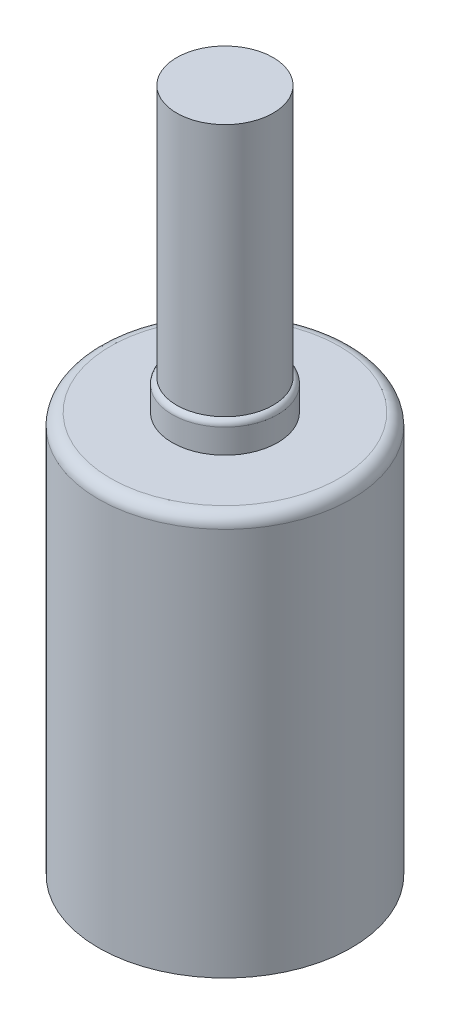
ISO-10303-21;
HEADER;
FILE_DESCRIPTION(('STEP AP214'),'2;1');
FILE_NAME('part.step','',(''),(''),'','','');
FILE_SCHEMA(('AUTOMOTIVE_DESIGN { 1 0 10303 214 1 1 1 1 }'));
ENDSEC;
DATA;
#1=APPLICATION_CONTEXT('core data for automotive mechanical design processes');
#2=APPLICATION_PROTOCOL_DEFINITION('international standard','automotive_design',2000,#1);
#3=PRODUCT_CONTEXT('',#1,'mechanical');
#4=PRODUCT('Part','Part','',(#3));
#5=PRODUCT_RELATED_PRODUCT_CATEGORY('part','',(#4));
#6=PRODUCT_DEFINITION_FORMATION('','',#4);
#7=PRODUCT_DEFINITION_CONTEXT('part definition',#1,'design');
#8=PRODUCT_DEFINITION('design','',#6,#7);
#9=PRODUCT_DEFINITION_SHAPE('','',#8);
#10=(LENGTH_UNIT() NAMED_UNIT(*) SI_UNIT(.MILLI.,.METRE.));
#11=(NAMED_UNIT(*) PLANE_ANGLE_UNIT() SI_UNIT($,.RADIAN.));
#12=(NAMED_UNIT(*) SI_UNIT($,.STERADIAN.) SOLID_ANGLE_UNIT());
#13=UNCERTAINTY_MEASURE_WITH_UNIT(LENGTH_MEASURE(1.E-05),#10,'distance_accuracy_value','');
#14=(GEOMETRIC_REPRESENTATION_CONTEXT(3) GLOBAL_UNCERTAINTY_ASSIGNED_CONTEXT((#13)) GLOBAL_UNIT_ASSIGNED_CONTEXT((#10,
#11,#12)) REPRESENTATION_CONTEXT('',''));
#15=CARTESIAN_POINT('',(0.,0.,0.));
#16=DIRECTION('',(0.,0.,1.));
#17=DIRECTION('',(1.,0.,0.));
#18=AXIS2_PLACEMENT_3D('',#15,#16,#17);
#19=CARTESIAN_POINT('',(0.,66.5,0.));
#20=DIRECTION('',(0.,-1.,0.));
#21=DIRECTION('',(0.,0.,-1.));
#22=AXIS2_PLACEMENT_3D('',#19,#20,#21);
#23=CYLINDRICAL_SURFACE('',#22,21.);
#24=CARTESIAN_POINT('',(0.,64.5,0.));
#25=DIRECTION('',(0.,1.,0.));
#26=DIRECTION('',(0.,0.,1.));
#27=AXIS2_PLACEMENT_3D('',#24,#25,#26);
#28=CIRCLE('',#27,21.);
#29=CARTESIAN_POINT('',(0.,64.5,21.));
#30=VERTEX_POINT('',#29);
#31=EDGE_CURVE('E56',#30,#30,#28,.F.);
#32=ORIENTED_EDGE('',*,*,#31,.T.);
#33=EDGE_LOOP('',(#32));
#34=FACE_BOUND('',#33,.T.);
#35=CARTESIAN_POINT('',(0.,0.,0.));
#36=DIRECTION('',(0.,1.,0.));
#37=DIRECTION('',(0.,0.,1.));
#38=AXIS2_PLACEMENT_3D('',#35,#36,#37);
#39=CIRCLE('',#38,21.);
#40=CARTESIAN_POINT('',(0.,0.,21.));
#41=VERTEX_POINT('',#40);
#42=EDGE_CURVE('E64',#41,#41,#39,.T.);
#43=ORIENTED_EDGE('',*,*,#42,.T.);
#44=EDGE_LOOP('',(#43));
#45=FACE_BOUND('',#44,.T.);
#46=ADVANCED_FACE('F32',(#34,#45),#23,.T.);
#47=CARTESIAN_POINT('',(0.,66.5,0.));
#48=DIRECTION('',(0.,1.,0.));
#49=DIRECTION('',(0.,0.,1.));
#50=AXIS2_PLACEMENT_3D('',#47,#48,#49);
#51=PLANE('',#50);
#52=CARTESIAN_POINT('',(0.,66.5,0.));
#53=DIRECTION('',(0.,1.,0.));
#54=DIRECTION('',(0.,0.,1.));
#55=AXIS2_PLACEMENT_3D('',#52,#53,#54);
#56=CIRCLE('',#55,19.);
#57=CARTESIAN_POINT('',(0.,66.5,19.));
#58=VERTEX_POINT('',#57);
#59=EDGE_CURVE('E60',#58,#58,#56,.T.);
#60=ORIENTED_EDGE('',*,*,#59,.T.);
#61=EDGE_LOOP('',(#60));
#62=FACE_BOUND('',#61,.T.);
#63=CARTESIAN_POINT('',(0.,66.5,0.));
#64=DIRECTION('',(0.,1.,0.));
#65=DIRECTION('',(0.,0.,1.));
#66=AXIS2_PLACEMENT_3D('',#63,#64,#65);
#67=CIRCLE('',#66,8.75);
#68=CARTESIAN_POINT('',(0.,66.5,8.75));
#69=VERTEX_POINT('',#68);
#70=EDGE_CURVE('E63',#69,#69,#67,.T.);
#71=ORIENTED_EDGE('',*,*,#70,.F.);
#72=EDGE_LOOP('',(#71));
#73=FACE_BOUND('',#72,.T.);
#74=ADVANCED_FACE('F103',(#62,#73),#51,.T.);
#75=CARTESIAN_POINT('',(0.,0.,0.));
#76=DIRECTION('',(0.,1.,0.));
#77=DIRECTION('',(0.,0.,1.));
#78=AXIS2_PLACEMENT_3D('',#75,#76,#77);
#79=PLANE('',#78);
#80=CARTESIAN_POINT('',(0.,0.,0.));
#81=DIRECTION('',(0.,-1.,0.));
#82=DIRECTION('',(0.,0.,-1.));
#83=AXIS2_PLACEMENT_3D('',#80,#81,#82);
#84=CIRCLE('',#83,7.25);
#85=CARTESIAN_POINT('',(0.,0.,-7.25));
#86=VERTEX_POINT('',#85);
#87=EDGE_CURVE('E55',#86,#86,#84,.T.);
#88=ORIENTED_EDGE('',*,*,#87,.F.);
#89=EDGE_LOOP('',(#88));
#90=FACE_BOUND('',#89,.T.);
#91=ORIENTED_EDGE('',*,*,#42,.F.);
#92=EDGE_LOOP('',(#91));
#93=FACE_BOUND('',#92,.T.);
#94=ADVANCED_FACE('F109',(#90,#93),#79,.F.);
#95=CARTESIAN_POINT('',(0.,71.5,0.));
#96=DIRECTION('',(0.,-1.,0.));
#97=DIRECTION('',(0.,0.,-1.));
#98=AXIS2_PLACEMENT_3D('',#95,#96,#97);
#99=CYLINDRICAL_SURFACE('',#98,8.75);
#100=CARTESIAN_POINT('',(0.,70.5317541634482,0.));
#101=DIRECTION('',(0.,1.,0.));
#102=DIRECTION('',(0.,0.,1.));
#103=AXIS2_PLACEMENT_3D('',#100,#101,#102);
#104=CIRCLE('',#103,8.75);
#105=CARTESIAN_POINT('',(0.,70.5317541634482,8.75));
#106=VERTEX_POINT('',#105);
#107=EDGE_CURVE('E52',#106,#106,#104,.F.);
#108=ORIENTED_EDGE('',*,*,#107,.T.);
#109=EDGE_LOOP('',(#108));
#110=FACE_BOUND('',#109,.T.);
#111=ORIENTED_EDGE('',*,*,#70,.T.);
#112=EDGE_LOOP('',(#111));
#113=FACE_BOUND('',#112,.T.);
#114=ADVANCED_FACE('F118',(#110,#113),#99,.T.);
#115=CARTESIAN_POINT('',(0.,64.5,0.));
#116=DIRECTION('',(0.,1.,0.));
#117=DIRECTION('',(0.,0.,1.));
#118=AXIS2_PLACEMENT_3D('',#115,#116,#117);
#119=TOROIDAL_SURFACE('',#118,19.,2.);
#120=ORIENTED_EDGE('',*,*,#31,.F.);
#121=EDGE_LOOP('',(#120));
#122=FACE_BOUND('',#121,.T.);
#123=ORIENTED_EDGE('',*,*,#59,.F.);
#124=EDGE_LOOP('',(#123));
#125=FACE_BOUND('',#124,.T.);
#126=ADVANCED_FACE('F115',(#122,#125),#119,.T.);
#127=CARTESIAN_POINT('',(0.,113.5,0.));
#128=DIRECTION('',(0.,-1.,0.));
#129=DIRECTION('',(0.,0.,-1.));
#130=AXIS2_PLACEMENT_3D('',#127,#128,#129);
#131=CYLINDRICAL_SURFACE('',#130,8.);
#132=CARTESIAN_POINT('',(0.,113.5,0.));
#133=DIRECTION('',(0.,1.,0.));
#134=DIRECTION('',(0.,0.,1.));
#135=AXIS2_PLACEMENT_3D('',#132,#133,#134);
#136=CIRCLE('',#135,8.);
#137=CARTESIAN_POINT('',(0.,113.5,-8.));
#138=VERTEX_POINT('',#137);
#139=EDGE_CURVE('E67',#138,#138,#136,.T.);
#140=CARTESIAN_POINT('',(0.,71.5,0.));
#141=DIRECTION('',(0.,1.,0.));
#142=DIRECTION('',(0.,0.,1.));
#143=AXIS2_PLACEMENT_3D('',#140,#141,#142);
#144=CIRCLE('',#143,8.);
#145=CARTESIAN_POINT('',(0.,71.5,-8.));
#146=VERTEX_POINT('',#145);
#147=EDGE_CURVE('E59',#146,#146,#144,.T.);
#148=CARTESIAN_POINT('',(0.,113.5,-8.));
#149=CARTESIAN_POINT('',(0.,113.0625,-8.));
#150=CARTESIAN_POINT('',(0.,112.625,-8.));
#151=CARTESIAN_POINT('',(0.,111.75,-8.));
#152=CARTESIAN_POINT('',(0.,111.3125,-8.));
#153=CARTESIAN_POINT('',(0.,110.4375,-8.));
#154=CARTESIAN_POINT('',(0.,110.,-8.));
#155=CARTESIAN_POINT('',(0.,109.125,-8.));
#156=CARTESIAN_POINT('',(0.,108.6875,-8.));
#157=CARTESIAN_POINT('',(0.,107.8125,-8.));
#158=CARTESIAN_POINT('',(0.,107.375,-8.));
#159=CARTESIAN_POINT('',(0.,106.5,-8.));
#160=CARTESIAN_POINT('',(0.,106.0625,-8.));
#161=CARTESIAN_POINT('',(0.,105.1875,-8.));
#162=CARTESIAN_POINT('',(0.,104.75,-8.));
#163=CARTESIAN_POINT('',(0.,103.875,-8.));
#164=CARTESIAN_POINT('',(0.,103.4375,-8.));
#165=CARTESIAN_POINT('',(0.,102.5625,-8.));
#166=CARTESIAN_POINT('',(0.,102.125,-8.));
#167=CARTESIAN_POINT('',(0.,101.25,-8.));
#168=CARTESIAN_POINT('',(0.,100.8125,-8.));
#169=CARTESIAN_POINT('',(0.,99.9375,-8.));
#170=CARTESIAN_POINT('',(0.,99.5,-8.));
#171=CARTESIAN_POINT('',(0.,98.625,-8.));
#172=CARTESIAN_POINT('',(0.,98.1875,-8.));
#173=CARTESIAN_POINT('',(0.,97.3125,-8.));
#174=CARTESIAN_POINT('',(0.,96.875,-8.));
#175=CARTESIAN_POINT('',(0.,96.,-8.));
#176=CARTESIAN_POINT('',(0.,95.5625,-8.));
#177=CARTESIAN_POINT('',(0.,94.6875,-8.));
#178=CARTESIAN_POINT('',(0.,94.25,-8.));
#179=CARTESIAN_POINT('',(0.,93.375,-8.));
#180=CARTESIAN_POINT('',(0.,92.9375,-8.));
#181=CARTESIAN_POINT('',(0.,92.0625,-8.));
#182=CARTESIAN_POINT('',(0.,91.625,-8.));
#183=CARTESIAN_POINT('',(0.,90.75,-8.));
#184=CARTESIAN_POINT('',(0.,90.3125,-8.));
#185=CARTESIAN_POINT('',(0.,89.4375,-8.));
#186=CARTESIAN_POINT('',(0.,89.,-8.));
#187=CARTESIAN_POINT('',(0.,88.125,-8.));
#188=CARTESIAN_POINT('',(0.,87.6875,-8.));
#189=CARTESIAN_POINT('',(0.,86.8125,-8.));
#190=CARTESIAN_POINT('',(0.,86.375,-8.));
#191=CARTESIAN_POINT('',(0.,85.5,-8.));
#192=CARTESIAN_POINT('',(0.,85.0625,-8.));
#193=CARTESIAN_POINT('',(0.,84.1875,-8.));
#194=CARTESIAN_POINT('',(0.,83.75,-8.));
#195=CARTESIAN_POINT('',(0.,82.875,-8.));
#196=CARTESIAN_POINT('',(0.,82.4375,-8.));
#197=CARTESIAN_POINT('',(0.,81.5625,-8.));
#198=CARTESIAN_POINT('',(0.,81.125,-8.));
#199=CARTESIAN_POINT('',(0.,80.25,-8.));
#200=CARTESIAN_POINT('',(0.,79.8125,-8.));
#201=CARTESIAN_POINT('',(0.,78.9375,-8.));
#202=CARTESIAN_POINT('',(0.,78.5,-8.));
#203=CARTESIAN_POINT('',(0.,77.625,-8.));
#204=CARTESIAN_POINT('',(0.,77.1875,-8.));
#205=CARTESIAN_POINT('',(0.,76.3125,-8.));
#206=CARTESIAN_POINT('',(0.,75.875,-8.));
#207=CARTESIAN_POINT('',(0.,75.,-8.));
#208=CARTESIAN_POINT('',(0.,74.5625,-8.));
#209=CARTESIAN_POINT('',(0.,73.6875,-8.));
#210=CARTESIAN_POINT('',(0.,73.25,-8.));
#211=CARTESIAN_POINT('',(0.,72.375,-8.));
#212=CARTESIAN_POINT('',(0.,71.9375,-8.));
#213=CARTESIAN_POINT('',(0.,71.5,-8.));
#214=B_SPLINE_CURVE_WITH_KNOTS('',3,(#148,#149,#150,#151,#152,#153,#154,#155,#156,#157,#158,
#159,#160,#161,#162,#163,#164,#165,#166,#167,#168,#169,#170,#171,#172,#173,#174,#175,#176,#177,
#178,#179,#180,#181,#182,#183,#184,#185,#186,#187,#188,#189,#190,#191,#192,#193,#194,#195,#196,
#197,#198,#199,#200,#201,#202,#203,#204,#205,#206,#207,#208,#209,#210,#211,#212,#213),
.UNSPECIFIED.,.F.,.F.,(4,2,2,2,2,2,2,2,2,2,2,2,2,2,2,2,2,2,2,2,2,2,2,2,2,2,2,2,2,2,2,2,4),(0.,
1.31250000000001,2.625,3.93750000000001,5.25,6.56250000000001,7.87500000000001,9.18750000000001,
10.5,11.8125,13.125,14.4375,15.75,17.0625,18.375,19.6875,21.,22.3125,23.625,24.9375,26.25,
27.5625,28.875,30.1875,31.5,32.8125,34.125,35.4375,36.75,38.0625,39.375,40.6875,42.),.UNSPECIFIED.);
#215=EDGE_CURVE('BSEAM117',#138,#146,#214,.T.);
#216=ORIENTED_EDGE('',*,*,#139,.F.);
#217=ORIENTED_EDGE('',*,*,#147,.T.);
#218=ORIENTED_EDGE('',*,*,#215,.T.);
#219=ORIENTED_EDGE('',*,*,#215,.F.);
#220=EDGE_LOOP('',(#216,#218,#217,#219));
#221=FACE_BOUND('',#220,.T.);
#222=ADVANCED_FACE('F117',(#221),#131,.T.);
#223=CARTESIAN_POINT('',(0.,113.5,0.));
#224=DIRECTION('',(0.,1.,0.));
#225=DIRECTION('',(0.,0.,1.));
#226=AXIS2_PLACEMENT_3D('',#223,#224,#225);
#227=PLANE('',#226);
#228=ORIENTED_EDGE('',*,*,#139,.T.);
#229=EDGE_LOOP('',(#228));
#230=FACE_BOUND('',#229,.T.);
#231=ADVANCED_FACE('F124',(#230),#227,.T.);
#232=CARTESIAN_POINT('',(0.,-5.,0.));
#233=DIRECTION('',(0.,1.,0.));
#234=DIRECTION('',(0.,0.,1.));
#235=AXIS2_PLACEMENT_3D('',#232,#233,#234);
#236=CYLINDRICAL_SURFACE('',#235,7.25);
#237=CARTESIAN_POINT('',(0.,-4.,0.));
#238=DIRECTION('',(0.,-1.,0.));
#239=DIRECTION('',(0.,0.,-1.));
#240=AXIS2_PLACEMENT_3D('',#237,#238,#239);
#241=CIRCLE('',#240,7.25);
#242=CARTESIAN_POINT('',(0.,-4.,-7.25));
#243=VERTEX_POINT('',#242);
#244=EDGE_CURVE('E43',#243,#243,#241,.F.);
#245=ORIENTED_EDGE('',*,*,#244,.T.);
#246=EDGE_LOOP('',(#245));
#247=FACE_BOUND('',#246,.T.);
#248=ORIENTED_EDGE('',*,*,#87,.T.);
#249=EDGE_LOOP('',(#248));
#250=FACE_BOUND('',#249,.T.);
#251=ADVANCED_FACE('F86',(#247,#250),#236,.T.);
#252=CARTESIAN_POINT('',(0.,-5.,0.));
#253=DIRECTION('',(0.,-1.,0.));
#254=DIRECTION('',(0.,0.,-1.));
#255=AXIS2_PLACEMENT_3D('',#252,#253,#254);
#256=PLANE('',#255);
#257=CARTESIAN_POINT('',(0.,-5.,0.));
#258=DIRECTION('',(0.,-1.,0.));
#259=DIRECTION('',(0.,0.,-1.));
#260=AXIS2_PLACEMENT_3D('',#257,#258,#259);
#261=CIRCLE('',#260,2.5);
#262=CARTESIAN_POINT('',(0.,-5.,-2.5));
#263=VERTEX_POINT('',#262);
#264=EDGE_CURVE('E74',#263,#263,#261,.T.);
#265=ORIENTED_EDGE('',*,*,#264,.F.);
#266=EDGE_LOOP('',(#265));
#267=FACE_BOUND('',#266,.T.);
#268=CARTESIAN_POINT('',(0.,-5.,0.));
#269=DIRECTION('',(0.,-1.,0.));
#270=DIRECTION('',(0.,0.,-1.));
#271=AXIS2_PLACEMENT_3D('',#268,#269,#270);
#272=CIRCLE('',#271,6.25);
#273=CARTESIAN_POINT('',(0.,-5.,-6.25));
#274=VERTEX_POINT('',#273);
#275=EDGE_CURVE('E47',#274,#274,#272,.T.);
#276=ORIENTED_EDGE('',*,*,#275,.T.);
#277=EDGE_LOOP('',(#276));
#278=FACE_BOUND('',#277,.T.);
#279=ADVANCED_FACE('F82',(#267,#278),#256,.T.);
#280=CARTESIAN_POINT('',(0.,70.5317541634482,0.));
#281=DIRECTION('',(0.,1.,0.));
#282=DIRECTION('',(0.,0.,1.));
#283=AXIS2_PLACEMENT_3D('',#280,#281,#282);
#284=TOROIDAL_SURFACE('',#283,7.75,1.);
#285=ORIENTED_EDGE('',*,*,#107,.F.);
#286=EDGE_LOOP('',(#285));
#287=FACE_BOUND('',#286,.T.);
#288=ORIENTED_EDGE('',*,*,#147,.F.);
#289=EDGE_LOOP('',(#288));
#290=FACE_BOUND('',#289,.T.);
#291=ADVANCED_FACE('F85',(#287,#290),#284,.T.);
#292=CARTESIAN_POINT('',(0.,-4.,0.));
#293=DIRECTION('',(0.,-1.,0.));
#294=DIRECTION('',(0.,0.,-1.));
#295=AXIS2_PLACEMENT_3D('',#292,#293,#294);
#296=TOROIDAL_SURFACE('',#295,6.25,1.);
#297=ORIENTED_EDGE('',*,*,#244,.F.);
#298=EDGE_LOOP('',(#297));
#299=FACE_BOUND('',#298,.T.);
#300=ORIENTED_EDGE('',*,*,#275,.F.);
#301=EDGE_LOOP('',(#300));
#302=FACE_BOUND('',#301,.T.);
#303=ADVANCED_FACE('F90',(#299,#302),#296,.T.);
#304=CARTESIAN_POINT('',(0.,-12.,0.));
#305=DIRECTION('',(0.,1.,0.));
#306=DIRECTION('',(0.,0.,1.));
#307=AXIS2_PLACEMENT_3D('',#304,#305,#306);
#308=CYLINDRICAL_SURFACE('',#307,2.5);
#309=CARTESIAN_POINT('',(0.,-11.5,0.));
#310=DIRECTION('',(0.,-1.,0.));
#311=DIRECTION('',(0.,0.,-1.));
#312=AXIS2_PLACEMENT_3D('',#309,#310,#311);
#313=CIRCLE('',#312,2.5);
#314=CARTESIAN_POINT('',(0.,-11.5,-2.5));
#315=VERTEX_POINT('',#314);
#316=EDGE_CURVE('E10',#315,#315,#313,.F.);
#317=ORIENTED_EDGE('',*,*,#316,.T.);
#318=EDGE_LOOP('',(#317));
#319=FACE_BOUND('',#318,.T.);
#320=ORIENTED_EDGE('',*,*,#264,.T.);
#321=EDGE_LOOP('',(#320));
#322=FACE_BOUND('',#321,.T.);
#323=ADVANCED_FACE('F80',(#319,#322),#308,.T.);
#324=CARTESIAN_POINT('',(0.,-12.,0.));
#325=DIRECTION('',(0.,-1.,0.));
#326=DIRECTION('',(0.,0.,-1.));
#327=AXIS2_PLACEMENT_3D('',#324,#325,#326);
#328=PLANE('',#327);
#329=CARTESIAN_POINT('',(0.,-12.,0.));
#330=DIRECTION('',(0.,-1.,0.));
#331=DIRECTION('',(0.,0.,-1.));
#332=AXIS2_PLACEMENT_3D('',#329,#330,#331);
#333=CIRCLE('',#332,2.);
#334=CARTESIAN_POINT('',(0.,-12.,-2.));
#335=VERTEX_POINT('',#334);
#336=EDGE_CURVE('E39',#335,#335,#333,.T.);
#337=ORIENTED_EDGE('',*,*,#336,.T.);
#338=EDGE_LOOP('',(#337));
#339=FACE_BOUND('',#338,.T.);
#340=ADVANCED_FACE('F97',(#339),#328,.T.);
#341=CARTESIAN_POINT('',(0.,-11.5,0.));
#342=DIRECTION('',(0.,-1.,0.));
#343=DIRECTION('',(0.,0.,-1.));
#344=AXIS2_PLACEMENT_3D('',#341,#342,#343);
#345=TOROIDAL_SURFACE('',#344,2.,0.5);
#346=ORIENTED_EDGE('',*,*,#316,.F.);
#347=EDGE_LOOP('',(#346));
#348=FACE_BOUND('',#347,.T.);
#349=ORIENTED_EDGE('',*,*,#336,.F.);
#350=EDGE_LOOP('',(#349));
#351=FACE_BOUND('',#350,.T.);
#352=ADVANCED_FACE('F34',(#348,#351),#345,.T.);
#353=CLOSED_SHELL('',(#46,#74,#94,#114,#126,#222,#231,#251,#279,#291,#303,#323,#340,#352));
#354=MANIFOLD_SOLID_BREP('B2',#353);
#355=ADVANCED_BREP_SHAPE_REPRESENTATION('',(#18,#354),#14);
#356=SHAPE_DEFINITION_REPRESENTATION(#9,#355);
ENDSEC;
END-ISO-10303-21;
